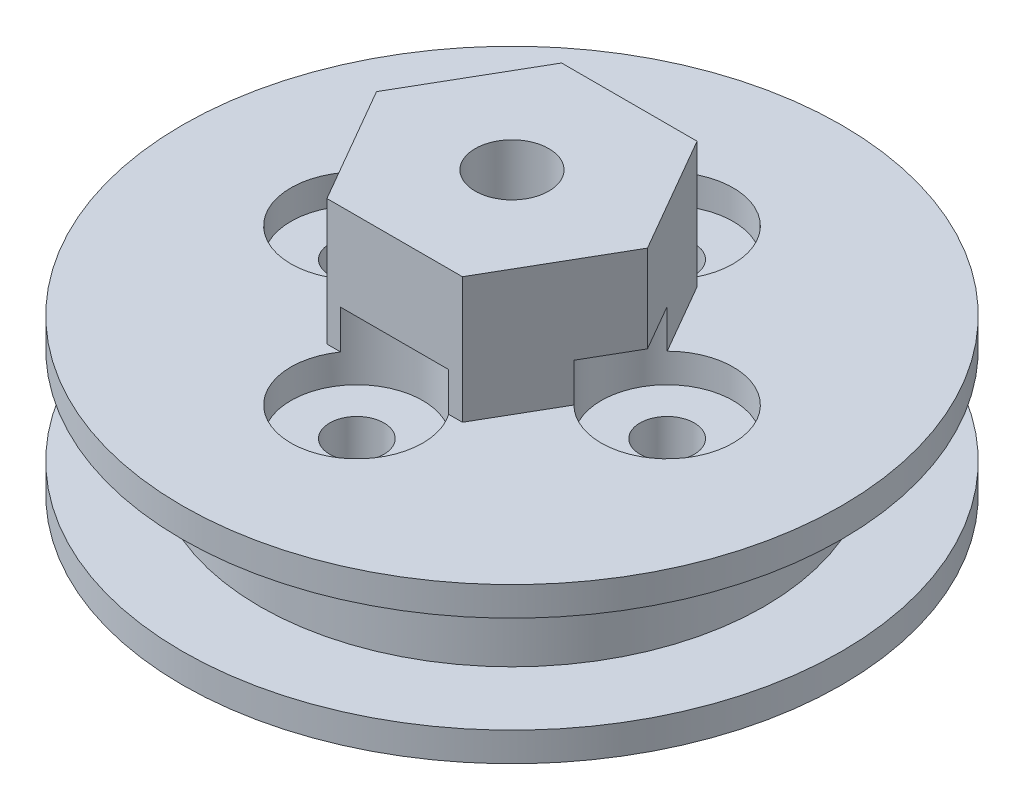
ISO-10303-21;
HEADER;
FILE_DESCRIPTION(('STEP AP214'),'2;1');
FILE_NAME('part.step','',(''),(''),'','','');
FILE_SCHEMA(('AUTOMOTIVE_DESIGN { 1 0 10303 214 1 1 1 1 }'));
ENDSEC;
DATA;
#1=APPLICATION_CONTEXT('core data for automotive mechanical design processes');
#2=APPLICATION_PROTOCOL_DEFINITION('international standard','automotive_design',2000,#1);
#3=PRODUCT_CONTEXT('',#1,'mechanical');
#4=PRODUCT('Part','Part','',(#3));
#5=PRODUCT_RELATED_PRODUCT_CATEGORY('part','',(#4));
#6=PRODUCT_DEFINITION_FORMATION('','',#4);
#7=PRODUCT_DEFINITION_CONTEXT('part definition',#1,'design');
#8=PRODUCT_DEFINITION('design','',#6,#7);
#9=PRODUCT_DEFINITION_SHAPE('','',#8);
#10=(LENGTH_UNIT() NAMED_UNIT(*) SI_UNIT(.MILLI.,.METRE.));
#11=(NAMED_UNIT(*) PLANE_ANGLE_UNIT() SI_UNIT($,.RADIAN.));
#12=(NAMED_UNIT(*) SI_UNIT($,.STERADIAN.) SOLID_ANGLE_UNIT());
#13=UNCERTAINTY_MEASURE_WITH_UNIT(LENGTH_MEASURE(1.E-05),#10,'distance_accuracy_value','');
#14=(GEOMETRIC_REPRESENTATION_CONTEXT(3) GLOBAL_UNCERTAINTY_ASSIGNED_CONTEXT((#13)) GLOBAL_UNIT_ASSIGNED_CONTEXT((#10,
#11,#12)) REPRESENTATION_CONTEXT('',''));
#15=CARTESIAN_POINT('',(0.,0.,0.));
#16=DIRECTION('',(0.,0.,1.));
#17=DIRECTION('',(1.,0.,0.));
#18=AXIS2_PLACEMENT_3D('',#15,#16,#17);
#19=CARTESIAN_POINT('',(0.,8.,0.));
#20=DIRECTION('',(0.,-1.,0.));
#21=DIRECTION('',(0.,0.,-1.));
#22=AXIS2_PLACEMENT_3D('',#19,#20,#21);
#23=CYLINDRICAL_SURFACE('',#22,17.);
#24=CARTESIAN_POINT('',(0.,1.5,0.));
#25=DIRECTION('',(0.,1.,0.));
#26=DIRECTION('',(0.,0.,1.));
#27=AXIS2_PLACEMENT_3D('',#24,#25,#26);
#28=CIRCLE('',#27,17.);
#29=CARTESIAN_POINT('',(0.,1.5,17.));
#30=VERTEX_POINT('',#29);
#31=EDGE_CURVE('E216',#30,#30,#28,.T.);
#32=ORIENTED_EDGE('',*,*,#31,.F.);
#33=EDGE_LOOP('',(#32));
#34=FACE_BOUND('',#33,.T.);
#35=CARTESIAN_POINT('',(0.,0.,0.));
#36=DIRECTION('',(0.,1.,0.));
#37=DIRECTION('',(0.,0.,1.));
#38=AXIS2_PLACEMENT_3D('',#35,#36,#37);
#39=CIRCLE('',#38,17.);
#40=CARTESIAN_POINT('',(0.,0.,17.));
#41=VERTEX_POINT('',#40);
#42=EDGE_CURVE('E49',#41,#41,#39,.T.);
#43=ORIENTED_EDGE('',*,*,#42,.T.);
#44=EDGE_LOOP('',(#43));
#45=FACE_BOUND('',#44,.T.);
#46=ADVANCED_FACE('F45',(#34,#45),#23,.T.);
#47=CARTESIAN_POINT('',(0.,8.,-8.));
#48=DIRECTION('',(0.,-1.,0.));
#49=DIRECTION('',(0.,0.,-1.));
#50=AXIS2_PLACEMENT_3D('',#47,#48,#49);
#51=CYLINDRICAL_SURFACE('',#50,1.4);
#52=CARTESIAN_POINT('',(0.,0.,-8.));
#53=DIRECTION('',(0.,1.,0.));
#54=DIRECTION('',(0.,0.,1.));
#55=AXIS2_PLACEMENT_3D('',#52,#53,#54);
#56=CIRCLE('',#55,1.4);
#57=CARTESIAN_POINT('',(0.,0.,-6.6));
#58=VERTEX_POINT('',#57);
#59=EDGE_CURVE('E345',#58,#58,#56,.T.);
#60=ORIENTED_EDGE('',*,*,#59,.F.);
#61=EDGE_LOOP('',(#60));
#62=FACE_BOUND('',#61,.T.);
#63=CARTESIAN_POINT('',(0.,6.5,-8.));
#64=DIRECTION('',(0.,1.,0.));
#65=DIRECTION('',(0.,0.,1.));
#66=AXIS2_PLACEMENT_3D('',#63,#64,#65);
#67=CIRCLE('',#66,1.4);
#68=CARTESIAN_POINT('',(0.,6.5,-6.6));
#69=VERTEX_POINT('',#68);
#70=EDGE_CURVE('E324',#69,#69,#67,.F.);
#71=ORIENTED_EDGE('',*,*,#70,.F.);
#72=EDGE_LOOP('',(#71));
#73=FACE_BOUND('',#72,.T.);
#74=ADVANCED_FACE('F407',(#62,#73),#51,.F.);
#75=CARTESIAN_POINT('',(8.,8.,0.));
#76=DIRECTION('',(0.,-1.,0.));
#77=DIRECTION('',(0.,0.,-1.));
#78=AXIS2_PLACEMENT_3D('',#75,#76,#77);
#79=CYLINDRICAL_SURFACE('',#78,1.4);
#80=CARTESIAN_POINT('',(8.,0.,0.));
#81=DIRECTION('',(0.,1.,0.));
#82=DIRECTION('',(0.,0.,1.));
#83=AXIS2_PLACEMENT_3D('',#80,#81,#82);
#84=CIRCLE('',#83,1.4);
#85=CARTESIAN_POINT('',(8.,0.,1.40000000000003));
#86=VERTEX_POINT('',#85);
#87=EDGE_CURVE('E341',#86,#86,#84,.T.);
#88=ORIENTED_EDGE('',*,*,#87,.F.);
#89=EDGE_LOOP('',(#88));
#90=FACE_BOUND('',#89,.T.);
#91=CARTESIAN_POINT('',(8.,6.5,0.));
#92=DIRECTION('',(0.,1.,0.));
#93=DIRECTION('',(0.,0.,1.));
#94=AXIS2_PLACEMENT_3D('',#91,#92,#93);
#95=CIRCLE('',#94,1.4);
#96=CARTESIAN_POINT('',(8.,6.5,1.40000000000003));
#97=VERTEX_POINT('',#96);
#98=EDGE_CURVE('E300',#97,#97,#95,.F.);
#99=ORIENTED_EDGE('',*,*,#98,.F.);
#100=EDGE_LOOP('',(#99));
#101=FACE_BOUND('',#100,.T.);
#102=ADVANCED_FACE('F412',(#90,#101),#79,.F.);
#103=CARTESIAN_POINT('',(4.51808198568511E-13,8.,8.));
#104=DIRECTION('',(0.,-1.,0.));
#105=DIRECTION('',(0.,0.,-1.));
#106=AXIS2_PLACEMENT_3D('',#103,#104,#105);
#107=CYLINDRICAL_SURFACE('',#106,1.4);
#108=CARTESIAN_POINT('',(4.51808198568511E-13,0.,8.));
#109=DIRECTION('',(0.,1.,0.));
#110=DIRECTION('',(0.,0.,1.));
#111=AXIS2_PLACEMENT_3D('',#108,#109,#110);
#112=CIRCLE('',#111,1.4);
#113=CARTESIAN_POINT('',(4.51808198568511E-13,0.,9.4));
#114=VERTEX_POINT('',#113);
#115=EDGE_CURVE('E337',#114,#114,#112,.T.);
#116=ORIENTED_EDGE('',*,*,#115,.F.);
#117=EDGE_LOOP('',(#116));
#118=FACE_BOUND('',#117,.T.);
#119=CARTESIAN_POINT('',(4.51808198568511E-13,6.5,8.));
#120=DIRECTION('',(0.,1.,0.));
#121=DIRECTION('',(0.,0.,1.));
#122=AXIS2_PLACEMENT_3D('',#119,#120,#121);
#123=CIRCLE('',#122,1.4);
#124=CARTESIAN_POINT('',(4.51808198568511E-13,6.5,9.4));
#125=VERTEX_POINT('',#124);
#126=EDGE_CURVE('E290',#125,#125,#123,.F.);
#127=ORIENTED_EDGE('',*,*,#126,.F.);
#128=EDGE_LOOP('',(#127));
#129=FACE_BOUND('',#128,.T.);
#130=ADVANCED_FACE('F384',(#118,#129),#107,.F.);
#131=CARTESIAN_POINT('',(-7.99999999999977,8.,2.26883816723573E-13));
#132=DIRECTION('',(0.,-1.,0.));
#133=DIRECTION('',(0.,0.,-1.));
#134=AXIS2_PLACEMENT_3D('',#131,#132,#133);
#135=CYLINDRICAL_SURFACE('',#134,1.4);
#136=CARTESIAN_POINT('',(-7.99999999999977,0.,2.26883816723573E-13));
#137=DIRECTION('',(0.,1.,0.));
#138=DIRECTION('',(0.,0.,1.));
#139=AXIS2_PLACEMENT_3D('',#136,#137,#138);
#140=CIRCLE('',#139,1.4);
#141=CARTESIAN_POINT('',(-7.99999999999977,0.,1.40000000000023));
#142=VERTEX_POINT('',#141);
#143=EDGE_CURVE('E299',#142,#142,#140,.T.);
#144=ORIENTED_EDGE('',*,*,#143,.F.);
#145=EDGE_LOOP('',(#144));
#146=FACE_BOUND('',#145,.T.);
#147=CARTESIAN_POINT('',(-7.99999999999977,6.5,2.26883816723573E-13));
#148=DIRECTION('',(0.,1.,0.));
#149=DIRECTION('',(0.,0.,1.));
#150=AXIS2_PLACEMENT_3D('',#147,#148,#149);
#151=CIRCLE('',#150,1.4);
#152=CARTESIAN_POINT('',(-7.99999999999977,6.5,1.40000000000023));
#153=VERTEX_POINT('',#152);
#154=EDGE_CURVE('E312',#153,#153,#151,.F.);
#155=ORIENTED_EDGE('',*,*,#154,.F.);
#156=EDGE_LOOP('',(#155));
#157=FACE_BOUND('',#156,.T.);
#158=ADVANCED_FACE('F381',(#146,#157),#135,.F.);
#159=CARTESIAN_POINT('',(0.,8.,0.));
#160=DIRECTION('',(0.,1.,0.));
#161=DIRECTION('',(0.,0.,1.));
#162=AXIS2_PLACEMENT_3D('',#159,#160,#161);
#163=PLANE('',#162);
#164=DIRECTION('',(1.,0.,0.));
#165=VECTOR('',#164,1.);
#166=CARTESIAN_POINT('',(-3.49296912859723,8.,6.05));
#167=LINE('',#166,#165);
#168=CARTESIAN_POINT('',(-3.49296912859723,8.,6.05));
#169=VERTEX_POINT('',#168);
#170=CARTESIAN_POINT('',(-2.78522889544064,8.,6.05));
#171=VERTEX_POINT('',#170);
#172=EDGE_CURVE('E223',#169,#171,#167,.T.);
#173=ORIENTED_EDGE('',*,*,#172,.F.);
#174=DIRECTION('',(0.5,0.,0.866025403784438));
#175=VECTOR('',#174,1.);
#176=CARTESIAN_POINT('',(-6.98593825719447,8.,0.));
#177=LINE('',#176,#175);
#178=CARTESIAN_POINT('',(-5.59714136828036,8.,2.40546677299284));
#179=VERTEX_POINT('',#178);
#180=EDGE_CURVE('E12',#179,#169,#177,.T.);
#181=ORIENTED_EDGE('',*,*,#180,.F.);
#182=CARTESIAN_POINT('',(-7.99999999999977,8.,2.26883816723573E-13));
#183=DIRECTION('',(0.,1.,0.));
#184=DIRECTION('',(0.,0.,1.));
#185=AXIS2_PLACEMENT_3D('',#182,#183,#184);
#186=CIRCLE('',#185,3.4);
#187=CARTESIAN_POINT('',(-5.59714136828052,8.,-2.40546677299255));
#188=VERTEX_POINT('',#187);
#189=EDGE_CURVE('E305',#188,#179,#186,.T.);
#190=ORIENTED_EDGE('',*,*,#189,.F.);
#191=DIRECTION('',(-0.5,0.,0.866025403784438));
#192=VECTOR('',#191,1.);
#193=CARTESIAN_POINT('',(-3.49296912859724,8.,-6.05));
#194=LINE('',#193,#192);
#195=CARTESIAN_POINT('',(-3.49296912859724,8.,-6.05));
#196=VERTEX_POINT('',#195);
#197=EDGE_CURVE('E230',#196,#188,#194,.T.);
#198=ORIENTED_EDGE('',*,*,#197,.F.);
#199=DIRECTION('',(-1.,0.,0.));
#200=VECTOR('',#199,1.);
#201=CARTESIAN_POINT('',(3.49296912859723,8.,-6.05));
#202=LINE('',#201,#200);
#203=CARTESIAN_POINT('',(-2.78522889544109,8.,-6.05));
#204=VERTEX_POINT('',#203);
#205=EDGE_CURVE('E55',#204,#196,#202,.T.);
#206=ORIENTED_EDGE('',*,*,#205,.F.);
#207=CARTESIAN_POINT('',(0.,8.,-8.));
#208=DIRECTION('',(0.,1.,0.));
#209=DIRECTION('',(0.,0.,1.));
#210=AXIS2_PLACEMENT_3D('',#207,#208,#209);
#211=CIRCLE('',#210,3.4);
#212=CARTESIAN_POINT('',(2.78522889544109,8.,-6.05));
#213=VERTEX_POINT('',#212);
#214=EDGE_CURVE('E317',#213,#204,#211,.T.);
#215=ORIENTED_EDGE('',*,*,#214,.F.);
#216=CARTESIAN_POINT('',(3.49296912859723,8.,-6.05));
#217=VERTEX_POINT('',#216);
#218=EDGE_CURVE('E168',#217,#213,#202,.T.);
#219=ORIENTED_EDGE('',*,*,#218,.F.);
#220=DIRECTION('',(-0.5,0.,-0.866025403784438));
#221=VECTOR('',#220,1.);
#222=CARTESIAN_POINT('',(6.98593825719447,8.,0.));
#223=LINE('',#222,#221);
#224=CARTESIAN_POINT('',(5.59714136828053,8.,-2.40546677299253));
#225=VERTEX_POINT('',#224);
#226=EDGE_CURVE('E254',#225,#217,#223,.T.);
#227=ORIENTED_EDGE('',*,*,#226,.F.);
#228=CARTESIAN_POINT('',(8.,8.,0.));
#229=DIRECTION('',(0.,1.,0.));
#230=DIRECTION('',(0.,0.,1.));
#231=AXIS2_PLACEMENT_3D('',#228,#229,#230);
#232=CIRCLE('',#231,3.4);
#233=CARTESIAN_POINT('',(5.59714136828051,8.,2.40546677299257));
#234=VERTEX_POINT('',#233);
#235=EDGE_CURVE('E295',#234,#225,#232,.T.);
#236=ORIENTED_EDGE('',*,*,#235,.F.);
#237=DIRECTION('',(0.5,0.,-0.866025403784438));
#238=VECTOR('',#237,1.);
#239=CARTESIAN_POINT('',(3.49296912859723,8.,6.05));
#240=LINE('',#239,#238);
#241=CARTESIAN_POINT('',(3.49296912859723,8.,6.05));
#242=VERTEX_POINT('',#241);
#243=EDGE_CURVE('E249',#242,#234,#240,.T.);
#244=ORIENTED_EDGE('',*,*,#243,.F.);
#245=CARTESIAN_POINT('',(2.78522889544154,8.,6.05));
#246=VERTEX_POINT('',#245);
#247=EDGE_CURVE('E250',#246,#242,#167,.T.);
#248=ORIENTED_EDGE('',*,*,#247,.F.);
#249=CARTESIAN_POINT('',(4.51808198568511E-13,8.,8.));
#250=DIRECTION('',(0.,1.,0.));
#251=DIRECTION('',(0.,0.,1.));
#252=AXIS2_PLACEMENT_3D('',#249,#250,#251);
#253=CIRCLE('',#252,3.4);
#254=EDGE_CURVE('E291',#171,#246,#253,.T.);
#255=ORIENTED_EDGE('',*,*,#254,.F.);
#256=EDGE_LOOP('',(#173,#181,#190,#198,#206,#215,#219,#227,#236,#244,#248,#255));
#257=FACE_BOUND('',#256,.T.);
#258=CARTESIAN_POINT('',(0.,8.,0.));
#259=DIRECTION('',(0.,1.,0.));
#260=DIRECTION('',(0.,0.,1.));
#261=AXIS2_PLACEMENT_3D('',#258,#259,#260);
#262=CIRCLE('',#261,17.);
#263=CARTESIAN_POINT('',(0.,8.,17.));
#264=VERTEX_POINT('',#263);
#265=EDGE_CURVE('E355',#264,#264,#262,.T.);
#266=ORIENTED_EDGE('',*,*,#265,.T.);
#267=EDGE_LOOP('',(#266));
#268=FACE_BOUND('',#267,.T.);
#269=ADVANCED_FACE('F370',(#257,#268),#163,.T.);
#270=CARTESIAN_POINT('',(0.,0.,0.));
#271=DIRECTION('',(0.,1.,0.));
#272=DIRECTION('',(0.,0.,1.));
#273=AXIS2_PLACEMENT_3D('',#270,#271,#272);
#274=PLANE('',#273);
#275=ORIENTED_EDGE('',*,*,#42,.F.);
#276=EDGE_LOOP('',(#275));
#277=FACE_BOUND('',#276,.T.);
#278=CARTESIAN_POINT('',(0.,0.,0.));
#279=DIRECTION('',(0.,1.,0.));
#280=DIRECTION('',(0.,0.,1.));
#281=AXIS2_PLACEMENT_3D('',#278,#279,#280);
#282=CIRCLE('',#281,4.3);
#283=CARTESIAN_POINT('',(0.,0.,4.3));
#284=VERTEX_POINT('',#283);
#285=EDGE_CURVE('E349',#284,#284,#282,.T.);
#286=ORIENTED_EDGE('',*,*,#285,.T.);
#287=EDGE_LOOP('',(#286));
#288=FACE_BOUND('',#287,.T.);
#289=ORIENTED_EDGE('',*,*,#59,.T.);
#290=EDGE_LOOP('',(#289));
#291=FACE_BOUND('',#290,.T.);
#292=ORIENTED_EDGE('',*,*,#87,.T.);
#293=EDGE_LOOP('',(#292));
#294=FACE_BOUND('',#293,.T.);
#295=ORIENTED_EDGE('',*,*,#115,.T.);
#296=EDGE_LOOP('',(#295));
#297=FACE_BOUND('',#296,.T.);
#298=ORIENTED_EDGE('',*,*,#143,.T.);
#299=EDGE_LOOP('',(#298));
#300=FACE_BOUND('',#299,.T.);
#301=ADVANCED_FACE('F367',(#277,#288,#291,#294,#297,#300),#274,.F.);
#302=CARTESIAN_POINT('',(0.,6.5,0.));
#303=DIRECTION('',(0.,1.,0.));
#304=DIRECTION('',(0.,0.,1.));
#305=AXIS2_PLACEMENT_3D('',#302,#303,#304);
#306=CIRCLE('',#305,17.);
#307=CARTESIAN_POINT('',(0.,6.5,17.));
#308=VERTEX_POINT('',#307);
#309=EDGE_CURVE('E426',#308,#308,#306,.T.);
#310=ORIENTED_EDGE('',*,*,#309,.T.);
#311=EDGE_LOOP('',(#310));
#312=FACE_BOUND('',#311,.T.);
#313=ORIENTED_EDGE('',*,*,#265,.F.);
#314=EDGE_LOOP('',(#313));
#315=FACE_BOUND('',#314,.T.);
#316=ADVANCED_FACE('F47',(#312,#315),#23,.T.);
#317=CARTESIAN_POINT('',(0.,8.,0.));
#318=DIRECTION('',(0.,-1.,0.));
#319=DIRECTION('',(0.,0.,-1.));
#320=AXIS2_PLACEMENT_3D('',#317,#318,#319);
#321=CYLINDRICAL_SURFACE('',#320,4.3);
#322=CARTESIAN_POINT('',(0.,8.,0.));
#323=DIRECTION('',(0.,1.,0.));
#324=DIRECTION('',(0.,0.,1.));
#325=AXIS2_PLACEMENT_3D('',#322,#323,#324);
#326=CIRCLE('',#325,4.3);
#327=CARTESIAN_POINT('',(0.,8.,4.3));
#328=VERTEX_POINT('',#327);
#329=EDGE_CURVE('E285',#328,#328,#326,.T.);
#330=ORIENTED_EDGE('',*,*,#329,.T.);
#331=EDGE_LOOP('',(#330));
#332=FACE_BOUND('',#331,.T.);
#333=ORIENTED_EDGE('',*,*,#285,.F.);
#334=EDGE_LOOP('',(#333));
#335=FACE_BOUND('',#334,.T.);
#336=ADVANCED_FACE('F401',(#332,#335),#321,.F.);
#337=CARTESIAN_POINT('',(-7.99999999999977,-9.61665222413705,2.26883816723573E-13));
#338=DIRECTION('',(0.,1.,0.));
#339=DIRECTION('',(0.,0.,1.));
#340=AXIS2_PLACEMENT_3D('',#337,#338,#339);
#341=CYLINDRICAL_SURFACE('',#340,3.4);
#342=CARTESIAN_POINT('',(-7.99999999999977,6.5,2.26883816723573E-13));
#343=DIRECTION('',(0.,1.,0.));
#344=DIRECTION('',(0.,0.,1.));
#345=AXIS2_PLACEMENT_3D('',#342,#343,#344);
#346=CIRCLE('',#345,3.4);
#347=CARTESIAN_POINT('',(-7.99999999999977,6.5,3.40000000000023));
#348=VERTEX_POINT('',#347);
#349=EDGE_CURVE('E316',#348,#348,#346,.F.);
#350=ORIENTED_EDGE('',*,*,#349,.T.);
#351=EDGE_LOOP('',(#350));
#352=FACE_BOUND('',#351,.T.);
#353=ORIENTED_EDGE('',*,*,#189,.T.);
#354=DIRECTION('',(0.,-1.,0.));
#355=VECTOR('',#354,1.);
#356=CARTESIAN_POINT('',(-5.59714136828036,10.,2.40546677299284));
#357=LINE('',#356,#355);
#358=CARTESIAN_POINT('',(-5.59714136828036,10.,2.40546677299284));
#359=VERTEX_POINT('',#358);
#360=EDGE_CURVE('E194',#359,#179,#357,.T.);
#361=ORIENTED_EDGE('',*,*,#360,.F.);
#362=CARTESIAN_POINT('',(-7.99999999999977,10.,2.26883816723573E-13));
#363=DIRECTION('',(0.,-1.,0.));
#364=DIRECTION('',(0.,0.,-1.));
#365=AXIS2_PLACEMENT_3D('',#362,#363,#364);
#366=CIRCLE('',#365,3.4);
#367=CARTESIAN_POINT('',(-5.59714136828052,10.,-2.40546677299255));
#368=VERTEX_POINT('',#367);
#369=EDGE_CURVE('E186',#368,#359,#366,.T.);
#370=ORIENTED_EDGE('',*,*,#369,.F.);
#371=DIRECTION('',(0.,-1.,0.));
#372=VECTOR('',#371,1.);
#373=CARTESIAN_POINT('',(-5.59714136828052,10.,-2.40546677299255));
#374=LINE('',#373,#372);
#375=EDGE_CURVE('E198',#368,#188,#374,.T.);
#376=ORIENTED_EDGE('',*,*,#375,.T.);
#377=EDGE_LOOP('',(#353,#361,#370,#376));
#378=FACE_BOUND('',#377,.T.);
#379=ADVANCED_FACE('F391',(#352,#378),#341,.F.);
#380=CARTESIAN_POINT('',(0.,6.5,0.));
#381=DIRECTION('',(0.,1.,0.));
#382=DIRECTION('',(0.,0.,1.));
#383=AXIS2_PLACEMENT_3D('',#380,#381,#382);
#384=PLANE('',#383);
#385=ORIENTED_EDGE('',*,*,#349,.F.);
#386=EDGE_LOOP('',(#385));
#387=FACE_BOUND('',#386,.T.);
#388=ORIENTED_EDGE('',*,*,#154,.T.);
#389=EDGE_LOOP('',(#388));
#390=FACE_BOUND('',#389,.T.);
#391=ADVANCED_FACE('F388',(#387,#390),#384,.T.);
#392=CARTESIAN_POINT('',(4.51808198568511E-13,-9.61665222413705,8.));
#393=DIRECTION('',(0.,1.,0.));
#394=DIRECTION('',(0.,0.,1.));
#395=AXIS2_PLACEMENT_3D('',#392,#393,#394);
#396=CYLINDRICAL_SURFACE('',#395,3.4);
#397=CARTESIAN_POINT('',(4.51808198568511E-13,6.5,8.));
#398=DIRECTION('',(0.,1.,0.));
#399=DIRECTION('',(0.,0.,1.));
#400=AXIS2_PLACEMENT_3D('',#397,#398,#399);
#401=CIRCLE('',#400,3.4);
#402=CARTESIAN_POINT('',(4.51808198568511E-13,6.5,11.4));
#403=VERTEX_POINT('',#402);
#404=EDGE_CURVE('E286',#403,#403,#401,.F.);
#405=ORIENTED_EDGE('',*,*,#404,.T.);
#406=EDGE_LOOP('',(#405));
#407=FACE_BOUND('',#406,.T.);
#408=ORIENTED_EDGE('',*,*,#254,.T.);
#409=DIRECTION('',(0.,-1.,0.));
#410=VECTOR('',#409,1.);
#411=CARTESIAN_POINT('',(2.78522889544154,10.,6.05));
#412=LINE('',#411,#410);
#413=CARTESIAN_POINT('',(2.78522889544154,10.,6.05));
#414=VERTEX_POINT('',#413);
#415=EDGE_CURVE('E209',#414,#246,#412,.T.);
#416=ORIENTED_EDGE('',*,*,#415,.F.);
#417=CARTESIAN_POINT('',(4.51808198568511E-13,10.,8.));
#418=DIRECTION('',(0.,-1.,0.));
#419=DIRECTION('',(0.,0.,-1.));
#420=AXIS2_PLACEMENT_3D('',#417,#418,#419);
#421=CIRCLE('',#420,3.4);
#422=CARTESIAN_POINT('',(-2.78522889544064,10.,6.05));
#423=VERTEX_POINT('',#422);
#424=EDGE_CURVE('E62',#423,#414,#421,.T.);
#425=ORIENTED_EDGE('',*,*,#424,.F.);
#426=DIRECTION('',(0.,-1.,0.));
#427=VECTOR('',#426,1.);
#428=CARTESIAN_POINT('',(-2.78522889544064,10.,6.05));
#429=LINE('',#428,#427);
#430=EDGE_CURVE('E213',#423,#171,#429,.T.);
#431=ORIENTED_EDGE('',*,*,#430,.T.);
#432=EDGE_LOOP('',(#408,#416,#425,#431));
#433=FACE_BOUND('',#432,.T.);
#434=ADVANCED_FACE('F390',(#407,#433),#396,.F.);
#435=CARTESIAN_POINT('',(0.,6.5,0.));
#436=DIRECTION('',(0.,1.,0.));
#437=DIRECTION('',(0.,0.,1.));
#438=AXIS2_PLACEMENT_3D('',#435,#436,#437);
#439=PLANE('',#438);
#440=ORIENTED_EDGE('',*,*,#404,.F.);
#441=EDGE_LOOP('',(#440));
#442=FACE_BOUND('',#441,.T.);
#443=ORIENTED_EDGE('',*,*,#126,.T.);
#444=EDGE_LOOP('',(#443));
#445=FACE_BOUND('',#444,.T.);
#446=ADVANCED_FACE('F398',(#442,#445),#439,.T.);
#447=CARTESIAN_POINT('',(8.,-9.61665222413705,0.));
#448=DIRECTION('',(0.,1.,0.));
#449=DIRECTION('',(0.,0.,1.));
#450=AXIS2_PLACEMENT_3D('',#447,#448,#449);
#451=CYLINDRICAL_SURFACE('',#450,3.4);
#452=CARTESIAN_POINT('',(8.,6.5,0.));
#453=DIRECTION('',(0.,1.,0.));
#454=DIRECTION('',(0.,0.,1.));
#455=AXIS2_PLACEMENT_3D('',#452,#453,#454);
#456=CIRCLE('',#455,3.4);
#457=CARTESIAN_POINT('',(8.,6.5,3.40000000000003));
#458=VERTEX_POINT('',#457);
#459=EDGE_CURVE('E304',#458,#458,#456,.F.);
#460=ORIENTED_EDGE('',*,*,#459,.T.);
#461=EDGE_LOOP('',(#460));
#462=FACE_BOUND('',#461,.T.);
#463=ORIENTED_EDGE('',*,*,#235,.T.);
#464=DIRECTION('',(0.,-1.,0.));
#465=VECTOR('',#464,1.);
#466=CARTESIAN_POINT('',(5.59714136828053,10.,-2.40546677299253));
#467=LINE('',#466,#465);
#468=CARTESIAN_POINT('',(5.59714136828053,10.,-2.40546677299253));
#469=VERTEX_POINT('',#468);
#470=EDGE_CURVE('E179',#469,#225,#467,.T.);
#471=ORIENTED_EDGE('',*,*,#470,.F.);
#472=CARTESIAN_POINT('',(8.,10.,0.));
#473=DIRECTION('',(0.,-1.,0.));
#474=DIRECTION('',(0.,0.,-1.));
#475=AXIS2_PLACEMENT_3D('',#472,#473,#474);
#476=CIRCLE('',#475,3.4);
#477=CARTESIAN_POINT('',(5.59714136828051,10.,2.40546677299257));
#478=VERTEX_POINT('',#477);
#479=EDGE_CURVE('E70',#478,#469,#476,.T.);
#480=ORIENTED_EDGE('',*,*,#479,.F.);
#481=DIRECTION('',(0.,-1.,0.));
#482=VECTOR('',#481,1.);
#483=CARTESIAN_POINT('',(5.59714136828051,10.,2.40546677299257));
#484=LINE('',#483,#482);
#485=EDGE_CURVE('E183',#478,#234,#484,.T.);
#486=ORIENTED_EDGE('',*,*,#485,.T.);
#487=EDGE_LOOP('',(#463,#471,#480,#486));
#488=FACE_BOUND('',#487,.T.);
#489=ADVANCED_FACE('F504',(#462,#488),#451,.F.);
#490=CARTESIAN_POINT('',(0.,6.5,0.));
#491=DIRECTION('',(0.,1.,0.));
#492=DIRECTION('',(0.,0.,1.));
#493=AXIS2_PLACEMENT_3D('',#490,#491,#492);
#494=PLANE('',#493);
#495=ORIENTED_EDGE('',*,*,#459,.F.);
#496=EDGE_LOOP('',(#495));
#497=FACE_BOUND('',#496,.T.);
#498=ORIENTED_EDGE('',*,*,#98,.T.);
#499=EDGE_LOOP('',(#498));
#500=FACE_BOUND('',#499,.T.);
#501=ADVANCED_FACE('F509',(#497,#500),#494,.T.);
#502=CARTESIAN_POINT('',(0.,-9.61665222413705,-8.));
#503=DIRECTION('',(0.,1.,0.));
#504=DIRECTION('',(0.,0.,1.));
#505=AXIS2_PLACEMENT_3D('',#502,#503,#504);
#506=CYLINDRICAL_SURFACE('',#505,3.4);
#507=CARTESIAN_POINT('',(0.,6.5,-8.));
#508=DIRECTION('',(0.,1.,0.));
#509=DIRECTION('',(0.,0.,1.));
#510=AXIS2_PLACEMENT_3D('',#507,#508,#509);
#511=CIRCLE('',#510,3.4);
#512=CARTESIAN_POINT('',(0.,6.5,-4.6));
#513=VERTEX_POINT('',#512);
#514=EDGE_CURVE('E328',#513,#513,#511,.F.);
#515=ORIENTED_EDGE('',*,*,#514,.T.);
#516=EDGE_LOOP('',(#515));
#517=FACE_BOUND('',#516,.T.);
#518=ORIENTED_EDGE('',*,*,#214,.T.);
#519=DIRECTION('',(0.,-1.,0.));
#520=VECTOR('',#519,1.);
#521=CARTESIAN_POINT('',(-2.78522889544109,10.,-6.05));
#522=LINE('',#521,#520);
#523=CARTESIAN_POINT('',(-2.78522889544109,10.,-6.05));
#524=VERTEX_POINT('',#523);
#525=EDGE_CURVE('E155',#524,#204,#522,.T.);
#526=ORIENTED_EDGE('',*,*,#525,.F.);
#527=CARTESIAN_POINT('',(0.,10.,-8.));
#528=DIRECTION('',(0.,-1.,0.));
#529=DIRECTION('',(0.,0.,-1.));
#530=AXIS2_PLACEMENT_3D('',#527,#528,#529);
#531=CIRCLE('',#530,3.4);
#532=CARTESIAN_POINT('',(2.78522889544109,10.,-6.05));
#533=VERTEX_POINT('',#532);
#534=EDGE_CURVE('E148',#533,#524,#531,.T.);
#535=ORIENTED_EDGE('',*,*,#534,.F.);
#536=DIRECTION('',(0.,-1.,0.));
#537=VECTOR('',#536,1.);
#538=CARTESIAN_POINT('',(2.78522889544109,10.,-6.05));
#539=LINE('',#538,#537);
#540=EDGE_CURVE('E153',#533,#213,#539,.T.);
#541=ORIENTED_EDGE('',*,*,#540,.T.);
#542=EDGE_LOOP('',(#518,#526,#535,#541));
#543=FACE_BOUND('',#542,.T.);
#544=ADVANCED_FACE('F151',(#517,#543),#506,.F.);
#545=CARTESIAN_POINT('',(0.,6.5,0.));
#546=DIRECTION('',(0.,1.,0.));
#547=DIRECTION('',(0.,0.,1.));
#548=AXIS2_PLACEMENT_3D('',#545,#546,#547);
#549=PLANE('',#548);
#550=ORIENTED_EDGE('',*,*,#514,.F.);
#551=EDGE_LOOP('',(#550));
#552=FACE_BOUND('',#551,.T.);
#553=ORIENTED_EDGE('',*,*,#70,.T.);
#554=EDGE_LOOP('',(#553));
#555=FACE_BOUND('',#554,.T.);
#556=ADVANCED_FACE('F477',(#552,#555),#549,.T.);
#557=CARTESIAN_POINT('',(0.,14.5,0.));
#558=DIRECTION('',(0.,1.,0.));
#559=DIRECTION('',(0.,0.,1.));
#560=AXIS2_PLACEMENT_3D('',#557,#558,#559);
#561=PLANE('',#560);
#562=DIRECTION('',(1.,0.,0.));
#563=VECTOR('',#562,1.);
#564=CARTESIAN_POINT('',(-3.49296912859723,14.5,6.05));
#565=LINE('',#564,#563);
#566=CARTESIAN_POINT('',(-3.49296912859723,14.5,6.05));
#567=VERTEX_POINT('',#566);
#568=CARTESIAN_POINT('',(3.49296912859723,14.5,6.05));
#569=VERTEX_POINT('',#568);
#570=EDGE_CURVE('E225',#567,#569,#565,.T.);
#571=ORIENTED_EDGE('',*,*,#570,.T.);
#572=DIRECTION('',(0.5,0.,-0.866025403784438));
#573=VECTOR('',#572,1.);
#574=CARTESIAN_POINT('',(3.49296912859723,14.5,6.05));
#575=LINE('',#574,#573);
#576=CARTESIAN_POINT('',(6.98593825719447,14.5,0.));
#577=VERTEX_POINT('',#576);
#578=EDGE_CURVE('E229',#569,#577,#575,.T.);
#579=ORIENTED_EDGE('',*,*,#578,.T.);
#580=DIRECTION('',(-0.5,0.,-0.866025403784438));
#581=VECTOR('',#580,1.);
#582=CARTESIAN_POINT('',(6.98593825719447,14.5,0.));
#583=LINE('',#582,#581);
#584=CARTESIAN_POINT('',(3.49296912859723,14.5,-6.05));
#585=VERTEX_POINT('',#584);
#586=EDGE_CURVE('E233',#577,#585,#583,.T.);
#587=ORIENTED_EDGE('',*,*,#586,.T.);
#588=DIRECTION('',(-1.,0.,0.));
#589=VECTOR('',#588,1.);
#590=CARTESIAN_POINT('',(3.49296912859723,14.5,-6.05));
#591=LINE('',#590,#589);
#592=CARTESIAN_POINT('',(-3.49296912859724,14.5,-6.05));
#593=VERTEX_POINT('',#592);
#594=EDGE_CURVE('E236',#585,#593,#591,.T.);
#595=ORIENTED_EDGE('',*,*,#594,.T.);
#596=DIRECTION('',(-0.5,0.,0.866025403784438));
#597=VECTOR('',#596,1.);
#598=CARTESIAN_POINT('',(-3.49296912859724,14.5,-6.05));
#599=LINE('',#598,#597);
#600=CARTESIAN_POINT('',(-6.98593825719447,14.5,0.));
#601=VERTEX_POINT('',#600);
#602=EDGE_CURVE('E239',#593,#601,#599,.T.);
#603=ORIENTED_EDGE('',*,*,#602,.T.);
#604=DIRECTION('',(0.5,0.,0.866025403784438));
#605=VECTOR('',#604,1.);
#606=CARTESIAN_POINT('',(-6.98593825719447,14.5,0.));
#607=LINE('',#606,#605);
#608=EDGE_CURVE('E242',#601,#567,#607,.T.);
#609=ORIENTED_EDGE('',*,*,#608,.T.);
#610=EDGE_LOOP('',(#571,#579,#587,#595,#603,#609));
#611=FACE_BOUND('',#610,.T.);
#612=CARTESIAN_POINT('',(0.,14.5,0.));
#613=DIRECTION('',(0.,1.,0.));
#614=DIRECTION('',(0.,0.,1.));
#615=AXIS2_PLACEMENT_3D('',#612,#613,#614);
#616=CIRCLE('',#615,1.9);
#617=CARTESIAN_POINT('',(0.,14.5,-1.9));
#618=VERTEX_POINT('',#617);
#619=EDGE_CURVE('E175',#618,#618,#616,.T.);
#620=ORIENTED_EDGE('',*,*,#619,.F.);
#621=EDGE_LOOP('',(#620));
#622=FACE_BOUND('',#621,.T.);
#623=ADVANCED_FACE('F473',(#611,#622),#561,.T.);
#624=CARTESIAN_POINT('',(0.,8.,0.));
#625=DIRECTION('',(0.,1.,0.));
#626=DIRECTION('',(0.,0.,1.));
#627=AXIS2_PLACEMENT_3D('',#624,#625,#626);
#628=PLANE('',#627);
#629=ORIENTED_EDGE('',*,*,#329,.F.);
#630=EDGE_LOOP('',(#629));
#631=FACE_BOUND('',#630,.T.);
#632=CARTESIAN_POINT('',(0.,8.,0.));
#633=DIRECTION('',(0.,1.,0.));
#634=DIRECTION('',(0.,0.,1.));
#635=AXIS2_PLACEMENT_3D('',#632,#633,#634);
#636=CIRCLE('',#635,1.9);
#637=CARTESIAN_POINT('',(0.,8.,-1.9));
#638=VERTEX_POINT('',#637);
#639=EDGE_CURVE('E170',#638,#638,#636,.T.);
#640=ORIENTED_EDGE('',*,*,#639,.T.);
#641=EDGE_LOOP('',(#640));
#642=FACE_BOUND('',#641,.T.);
#643=ADVANCED_FACE('F476',(#631,#642),#628,.F.);
#644=CARTESIAN_POINT('',(-3.49296912859723,14.5,6.05));
#645=DIRECTION('',(0.,0.,-1.));
#646=DIRECTION('',(-1.,0.,0.));
#647=AXIS2_PLACEMENT_3D('',#644,#645,#646);
#648=PLANE('',#647);
#649=DIRECTION('',(-1.,0.,0.));
#650=VECTOR('',#649,1.);
#651=CARTESIAN_POINT('',(2.78522889544154,10.,6.05));
#652=LINE('',#651,#650);
#653=EDGE_CURVE('E212',#414,#423,#652,.T.);
#654=ORIENTED_EDGE('',*,*,#653,.F.);
#655=ORIENTED_EDGE('',*,*,#415,.T.);
#656=ORIENTED_EDGE('',*,*,#247,.T.);
#657=DIRECTION('',(0.,-1.,0.));
#658=VECTOR('',#657,1.);
#659=CARTESIAN_POINT('',(3.49296912859723,14.5,6.05));
#660=LINE('',#659,#658);
#661=EDGE_CURVE('E281',#569,#242,#660,.T.);
#662=ORIENTED_EDGE('',*,*,#661,.F.);
#663=ORIENTED_EDGE('',*,*,#570,.F.);
#664=DIRECTION('',(0.,-1.,0.));
#665=VECTOR('',#664,1.);
#666=CARTESIAN_POINT('',(-3.49296912859723,14.5,6.05));
#667=LINE('',#666,#665);
#668=EDGE_CURVE('E245',#567,#169,#667,.T.);
#669=ORIENTED_EDGE('',*,*,#668,.T.);
#670=ORIENTED_EDGE('',*,*,#172,.T.);
#671=ORIENTED_EDGE('',*,*,#430,.F.);
#672=EDGE_LOOP('',(#654,#655,#656,#662,#663,#669,#670,#671));
#673=FACE_BOUND('',#672,.T.);
#674=ADVANCED_FACE('F481',(#673),#648,.F.);
#675=CARTESIAN_POINT('',(3.49296912859723,14.5,6.05));
#676=DIRECTION('',(-0.866025403784438,0.,-0.5));
#677=DIRECTION('',(-0.5,0.,0.866025403784439));
#678=AXIS2_PLACEMENT_3D('',#675,#676,#677);
#679=PLANE('',#678);
#680=ORIENTED_EDGE('',*,*,#243,.T.);
#681=ORIENTED_EDGE('',*,*,#485,.F.);
#682=DIRECTION('',(-0.5,0.,0.866025403784439));
#683=VECTOR('',#682,1.);
#684=CARTESIAN_POINT('',(6.98593825719447,10.,0.));
#685=LINE('',#684,#683);
#686=CARTESIAN_POINT('',(6.98593825719447,10.,0.));
#687=VERTEX_POINT('',#686);
#688=EDGE_CURVE('E182',#687,#478,#685,.T.);
#689=ORIENTED_EDGE('',*,*,#688,.F.);
#690=DIRECTION('',(0.,-1.,0.));
#691=VECTOR('',#690,1.);
#692=CARTESIAN_POINT('',(6.98593825719447,14.5,0.));
#693=LINE('',#692,#691);
#694=EDGE_CURVE('E277',#577,#687,#693,.T.);
#695=ORIENTED_EDGE('',*,*,#694,.F.);
#696=ORIENTED_EDGE('',*,*,#578,.F.);
#697=ORIENTED_EDGE('',*,*,#661,.T.);
#698=EDGE_LOOP('',(#680,#681,#689,#695,#696,#697));
#699=FACE_BOUND('',#698,.T.);
#700=ADVANCED_FACE('F495',(#699),#679,.F.);
#701=CARTESIAN_POINT('',(6.98593825719447,14.5,0.));
#702=DIRECTION('',(-0.866025403784438,0.,0.5));
#703=DIRECTION('',(0.5,0.,0.866025403784438));
#704=AXIS2_PLACEMENT_3D('',#701,#702,#703);
#705=PLANE('',#704);
#706=DIRECTION('',(0.5,0.,0.866025403784438));
#707=VECTOR('',#706,1.);
#708=CARTESIAN_POINT('',(5.59714136828053,10.,-2.40546677299253));
#709=LINE('',#708,#707);
#710=EDGE_CURVE('E189',#469,#687,#709,.T.);
#711=ORIENTED_EDGE('',*,*,#710,.F.);
#712=ORIENTED_EDGE('',*,*,#470,.T.);
#713=ORIENTED_EDGE('',*,*,#226,.T.);
#714=DIRECTION('',(0.,-1.,0.));
#715=VECTOR('',#714,1.);
#716=CARTESIAN_POINT('',(3.49296912859723,14.5,-6.05));
#717=LINE('',#716,#715);
#718=EDGE_CURVE('E274',#585,#217,#717,.T.);
#719=ORIENTED_EDGE('',*,*,#718,.F.);
#720=ORIENTED_EDGE('',*,*,#586,.F.);
#721=ORIENTED_EDGE('',*,*,#694,.T.);
#722=EDGE_LOOP('',(#711,#712,#713,#719,#720,#721));
#723=FACE_BOUND('',#722,.T.);
#724=ADVANCED_FACE('F492',(#723),#705,.F.);
#725=CARTESIAN_POINT('',(3.49296912859723,14.5,-6.05));
#726=DIRECTION('',(0.,0.,1.));
#727=DIRECTION('',(1.,0.,0.));
#728=AXIS2_PLACEMENT_3D('',#725,#726,#727);
#729=PLANE('',#728);
#730=DIRECTION('',(1.,0.,0.));
#731=VECTOR('',#730,1.);
#732=CARTESIAN_POINT('',(-2.78522889544109,10.,-6.05));
#733=LINE('',#732,#731);
#734=EDGE_CURVE('E159',#524,#533,#733,.T.);
#735=ORIENTED_EDGE('',*,*,#734,.F.);
#736=ORIENTED_EDGE('',*,*,#525,.T.);
#737=ORIENTED_EDGE('',*,*,#205,.T.);
#738=DIRECTION('',(0.,-1.,0.));
#739=VECTOR('',#738,1.);
#740=CARTESIAN_POINT('',(-3.49296912859724,14.5,-6.05));
#741=LINE('',#740,#739);
#742=EDGE_CURVE('E270',#593,#196,#741,.T.);
#743=ORIENTED_EDGE('',*,*,#742,.F.);
#744=ORIENTED_EDGE('',*,*,#594,.F.);
#745=ORIENTED_EDGE('',*,*,#718,.T.);
#746=ORIENTED_EDGE('',*,*,#218,.T.);
#747=ORIENTED_EDGE('',*,*,#540,.F.);
#748=EDGE_LOOP('',(#735,#736,#737,#743,#744,#745,#746,#747));
#749=FACE_BOUND('',#748,.T.);
#750=ADVANCED_FACE('F166',(#749),#729,.F.);
#751=CARTESIAN_POINT('',(-3.49296912859724,14.5,-6.05));
#752=DIRECTION('',(0.866025403784439,0.,0.5));
#753=DIRECTION('',(0.5,0.,-0.866025403784439));
#754=AXIS2_PLACEMENT_3D('',#751,#752,#753);
#755=PLANE('',#754);
#756=ORIENTED_EDGE('',*,*,#197,.T.);
#757=ORIENTED_EDGE('',*,*,#375,.F.);
#758=DIRECTION('',(0.5,0.,-0.866025403784439));
#759=VECTOR('',#758,1.);
#760=CARTESIAN_POINT('',(-6.98593825719447,10.,0.));
#761=LINE('',#760,#759);
#762=CARTESIAN_POINT('',(-6.98593825719447,10.,0.));
#763=VERTEX_POINT('',#762);
#764=EDGE_CURVE('E197',#763,#368,#761,.T.);
#765=ORIENTED_EDGE('',*,*,#764,.F.);
#766=DIRECTION('',(0.,-1.,0.));
#767=VECTOR('',#766,1.);
#768=CARTESIAN_POINT('',(-6.98593825719447,14.5,0.));
#769=LINE('',#768,#767);
#770=EDGE_CURVE('E266',#601,#763,#769,.T.);
#771=ORIENTED_EDGE('',*,*,#770,.F.);
#772=ORIENTED_EDGE('',*,*,#602,.F.);
#773=ORIENTED_EDGE('',*,*,#742,.T.);
#774=EDGE_LOOP('',(#756,#757,#765,#771,#772,#773));
#775=FACE_BOUND('',#774,.T.);
#776=ADVANCED_FACE('F485',(#775),#755,.F.);
#777=CARTESIAN_POINT('',(-6.98593825719447,14.5,0.));
#778=DIRECTION('',(0.866025403784438,0.,-0.5));
#779=DIRECTION('',(-0.5,0.,-0.866025403784439));
#780=AXIS2_PLACEMENT_3D('',#777,#778,#779);
#781=PLANE('',#780);
#782=DIRECTION('',(-0.5,0.,-0.866025403784438));
#783=VECTOR('',#782,1.);
#784=CARTESIAN_POINT('',(-5.59714136828036,10.,2.40546677299284));
#785=LINE('',#784,#783);
#786=EDGE_CURVE('E204',#359,#763,#785,.T.);
#787=ORIENTED_EDGE('',*,*,#786,.F.);
#788=ORIENTED_EDGE('',*,*,#360,.T.);
#789=ORIENTED_EDGE('',*,*,#180,.T.);
#790=ORIENTED_EDGE('',*,*,#668,.F.);
#791=ORIENTED_EDGE('',*,*,#608,.F.);
#792=ORIENTED_EDGE('',*,*,#770,.T.);
#793=EDGE_LOOP('',(#787,#788,#789,#790,#791,#792));
#794=FACE_BOUND('',#793,.T.);
#795=ADVANCED_FACE('F471',(#794),#781,.F.);
#796=CARTESIAN_POINT('',(0.,14.5,0.));
#797=DIRECTION('',(0.,-1.,0.));
#798=DIRECTION('',(0.,0.,-1.));
#799=AXIS2_PLACEMENT_3D('',#796,#797,#798);
#800=CYLINDRICAL_SURFACE('',#799,1.9);
#801=CARTESIAN_POINT('',(0.,14.5,-1.9));
#802=CARTESIAN_POINT('',(0.,14.4322916666667,-1.9));
#803=CARTESIAN_POINT('',(0.,14.3645833333333,-1.9));
#804=CARTESIAN_POINT('',(0.,14.2291666666667,-1.9));
#805=CARTESIAN_POINT('',(0.,14.1614583333333,-1.9));
#806=CARTESIAN_POINT('',(0.,14.0260416666667,-1.9));
#807=CARTESIAN_POINT('',(0.,13.9583333333333,-1.9));
#808=CARTESIAN_POINT('',(0.,13.8229166666667,-1.9));
#809=CARTESIAN_POINT('',(0.,13.7552083333333,-1.9));
#810=CARTESIAN_POINT('',(0.,13.6197916666667,-1.9));
#811=CARTESIAN_POINT('',(0.,13.5520833333333,-1.9));
#812=CARTESIAN_POINT('',(0.,13.4166666666667,-1.9));
#813=CARTESIAN_POINT('',(0.,13.3489583333333,-1.9));
#814=CARTESIAN_POINT('',(0.,13.2135416666667,-1.9));
#815=CARTESIAN_POINT('',(0.,13.1458333333333,-1.9));
#816=CARTESIAN_POINT('',(0.,13.0104166666667,-1.9));
#817=CARTESIAN_POINT('',(0.,12.9427083333333,-1.9));
#818=CARTESIAN_POINT('',(0.,12.8072916666667,-1.9));
#819=CARTESIAN_POINT('',(0.,12.7395833333333,-1.9));
#820=CARTESIAN_POINT('',(0.,12.6041666666667,-1.9));
#821=CARTESIAN_POINT('',(0.,12.5364583333333,-1.9));
#822=CARTESIAN_POINT('',(0.,12.4010416666667,-1.9));
#823=CARTESIAN_POINT('',(0.,12.3333333333333,-1.9));
#824=CARTESIAN_POINT('',(0.,12.1979166666667,-1.9));
#825=CARTESIAN_POINT('',(0.,12.1302083333333,-1.9));
#826=CARTESIAN_POINT('',(0.,11.9947916666667,-1.9));
#827=CARTESIAN_POINT('',(0.,11.9270833333333,-1.9));
#828=CARTESIAN_POINT('',(0.,11.7916666666667,-1.9));
#829=CARTESIAN_POINT('',(0.,11.7239583333333,-1.9));
#830=CARTESIAN_POINT('',(0.,11.5885416666667,-1.9));
#831=CARTESIAN_POINT('',(0.,11.5208333333333,-1.9));
#832=CARTESIAN_POINT('',(0.,11.3854166666667,-1.9));
#833=CARTESIAN_POINT('',(0.,11.3177083333333,-1.9));
#834=CARTESIAN_POINT('',(0.,11.1822916666667,-1.9));
#835=CARTESIAN_POINT('',(0.,11.1145833333333,-1.9));
#836=CARTESIAN_POINT('',(0.,10.9791666666667,-1.9));
#837=CARTESIAN_POINT('',(0.,10.9114583333333,-1.9));
#838=CARTESIAN_POINT('',(0.,10.7760416666667,-1.9));
#839=CARTESIAN_POINT('',(0.,10.7083333333333,-1.9));
#840=CARTESIAN_POINT('',(0.,10.5729166666667,-1.9));
#841=CARTESIAN_POINT('',(0.,10.5052083333333,-1.9));
#842=CARTESIAN_POINT('',(0.,10.3697916666667,-1.9));
#843=CARTESIAN_POINT('',(0.,10.3020833333333,-1.9));
#844=CARTESIAN_POINT('',(0.,10.1666666666667,-1.9));
#845=CARTESIAN_POINT('',(0.,10.0989583333333,-1.9));
#846=CARTESIAN_POINT('',(0.,9.96354166666667,-1.9));
#847=CARTESIAN_POINT('',(0.,9.89583333333333,-1.9));
#848=CARTESIAN_POINT('',(0.,9.76041666666667,-1.9));
#849=CARTESIAN_POINT('',(0.,9.69270833333333,-1.9));
#850=CARTESIAN_POINT('',(0.,9.55729166666667,-1.9));
#851=CARTESIAN_POINT('',(0.,9.48958333333333,-1.9));
#852=CARTESIAN_POINT('',(0.,9.35416666666667,-1.9));
#853=CARTESIAN_POINT('',(0.,9.28645833333333,-1.9));
#854=CARTESIAN_POINT('',(0.,9.15104166666667,-1.9));
#855=CARTESIAN_POINT('',(0.,9.08333333333333,-1.9));
#856=CARTESIAN_POINT('',(0.,8.94791666666667,-1.9));
#857=CARTESIAN_POINT('',(0.,8.88020833333333,-1.9));
#858=CARTESIAN_POINT('',(0.,8.74479166666667,-1.9));
#859=CARTESIAN_POINT('',(0.,8.67708333333333,-1.9));
#860=CARTESIAN_POINT('',(0.,8.54166666666667,-1.9));
#861=CARTESIAN_POINT('',(0.,8.47395833333333,-1.9));
#862=CARTESIAN_POINT('',(0.,8.33854166666667,-1.9));
#863=CARTESIAN_POINT('',(0.,8.27083333333333,-1.9));
#864=CARTESIAN_POINT('',(0.,8.13541666666667,-1.9));
#865=CARTESIAN_POINT('',(0.,8.06770833333333,-1.9));
#866=CARTESIAN_POINT('',(0.,8.,-1.9));
#867=B_SPLINE_CURVE_WITH_KNOTS('',3,(#801,#802,#803,#804,#805,#806,#807,#808,#809,#810,#811,
#812,#813,#814,#815,#816,#817,#818,#819,#820,#821,#822,#823,#824,#825,#826,#827,#828,#829,#830,
#831,#832,#833,#834,#835,#836,#837,#838,#839,#840,#841,#842,#843,#844,#845,#846,#847,#848,#849,
#850,#851,#852,#853,#854,#855,#856,#857,#858,#859,#860,#861,#862,#863,#864,#865,#866),
.UNSPECIFIED.,.F.,.F.,(4,2,2,2,2,2,2,2,2,2,2,2,2,2,2,2,2,2,2,2,2,2,2,2,2,2,2,2,2,2,2,2,4),(0.,
0.203125,0.40625,0.609375000000001,0.812500000000001,1.015625,1.21875,1.421875,1.625,1.828125,
2.03125,2.234375,2.4375,2.640625,2.84375,3.046875,3.25,3.453125,3.65625,3.859375,4.0625,
4.265625,4.46875,4.671875,4.875,5.078125,5.28125,5.484375,5.6875,5.890625,6.09375,6.296875,6.5),.UNSPECIFIED.);
#868=EDGE_CURVE('BSEAM466',#618,#638,#867,.T.);
#869=ORIENTED_EDGE('',*,*,#619,.T.);
#870=ORIENTED_EDGE('',*,*,#639,.F.);
#871=ORIENTED_EDGE('',*,*,#868,.T.);
#872=ORIENTED_EDGE('',*,*,#868,.F.);
#873=EDGE_LOOP('',(#869,#871,#870,#872));
#874=FACE_BOUND('',#873,.T.);
#875=ADVANCED_FACE('F466',(#874),#800,.F.);
#876=CARTESIAN_POINT('',(-7.99999999999977,10.,2.26883816723573E-13));
#877=DIRECTION('',(0.,-1.,0.));
#878=DIRECTION('',(0.,0.,-1.));
#879=AXIS2_PLACEMENT_3D('',#876,#877,#878);
#880=PLANE('',#879);
#881=ORIENTED_EDGE('',*,*,#369,.T.);
#882=ORIENTED_EDGE('',*,*,#786,.T.);
#883=ORIENTED_EDGE('',*,*,#764,.T.);
#884=EDGE_LOOP('',(#881,#882,#883));
#885=FACE_BOUND('',#884,.T.);
#886=ADVANCED_FACE('F462',(#885),#880,.T.);
#887=CARTESIAN_POINT('',(0.,10.,-8.));
#888=DIRECTION('',(0.,-1.,0.));
#889=DIRECTION('',(0.,0.,-1.));
#890=AXIS2_PLACEMENT_3D('',#887,#888,#889);
#891=PLANE('',#890);
#892=ORIENTED_EDGE('',*,*,#534,.T.);
#893=ORIENTED_EDGE('',*,*,#734,.T.);
#894=EDGE_LOOP('',(#892,#893));
#895=FACE_BOUND('',#894,.T.);
#896=ADVANCED_FACE('F161',(#895),#891,.T.);
#897=CARTESIAN_POINT('',(8.,10.,0.));
#898=DIRECTION('',(0.,-1.,0.));
#899=DIRECTION('',(0.,0.,-1.));
#900=AXIS2_PLACEMENT_3D('',#897,#898,#899);
#901=PLANE('',#900);
#902=ORIENTED_EDGE('',*,*,#479,.T.);
#903=ORIENTED_EDGE('',*,*,#710,.T.);
#904=ORIENTED_EDGE('',*,*,#688,.T.);
#905=EDGE_LOOP('',(#902,#903,#904));
#906=FACE_BOUND('',#905,.T.);
#907=ADVANCED_FACE('F455',(#906),#901,.T.);
#908=CARTESIAN_POINT('',(4.51808198568511E-13,10.,8.));
#909=DIRECTION('',(0.,-1.,0.));
#910=DIRECTION('',(0.,0.,-1.));
#911=AXIS2_PLACEMENT_3D('',#908,#909,#910);
#912=PLANE('',#911);
#913=ORIENTED_EDGE('',*,*,#424,.T.);
#914=ORIENTED_EDGE('',*,*,#653,.T.);
#915=EDGE_LOOP('',(#913,#914));
#916=FACE_BOUND('',#915,.T.);
#917=ADVANCED_FACE('F445',(#916),#912,.T.);
#918=CARTESIAN_POINT('',(0.,1.5,17.));
#919=DIRECTION('',(0.,-1.,0.));
#920=DIRECTION('',(0.,0.,-1.));
#921=AXIS2_PLACEMENT_3D('',#918,#919,#920);
#922=PLANE('',#921);
#923=CARTESIAN_POINT('',(0.,1.5,0.));
#924=DIRECTION('',(0.,1.,0.));
#925=DIRECTION('',(0.,0.,1.));
#926=AXIS2_PLACEMENT_3D('',#923,#924,#925);
#927=CIRCLE('',#926,13.);
#928=CARTESIAN_POINT('',(0.,1.5,13.));
#929=VERTEX_POINT('',#928);
#930=EDGE_CURVE('E433',#929,#929,#927,.T.);
#931=ORIENTED_EDGE('',*,*,#930,.F.);
#932=EDGE_LOOP('',(#931));
#933=FACE_BOUND('',#932,.T.);
#934=ORIENTED_EDGE('',*,*,#31,.T.);
#935=EDGE_LOOP('',(#934));
#936=FACE_BOUND('',#935,.T.);
#937=ADVANCED_FACE('F442',(#933,#936),#922,.F.);
#938=CARTESIAN_POINT('',(0.,18.7094897508567,0.));
#939=DIRECTION('',(0.,1.,0.));
#940=DIRECTION('',(0.,0.,1.));
#941=AXIS2_PLACEMENT_3D('',#938,#939,#940);
#942=CYLINDRICAL_SURFACE('',#941,13.);
#943=CARTESIAN_POINT('',(0.,6.5,0.));
#944=DIRECTION('',(0.,1.,0.));
#945=DIRECTION('',(0.,0.,1.));
#946=AXIS2_PLACEMENT_3D('',#943,#944,#945);
#947=CIRCLE('',#946,13.);
#948=CARTESIAN_POINT('',(0.,6.5,13.));
#949=VERTEX_POINT('',#948);
#950=EDGE_CURVE('E429',#949,#949,#947,.T.);
#951=ORIENTED_EDGE('',*,*,#950,.F.);
#952=EDGE_LOOP('',(#951));
#953=FACE_BOUND('',#952,.T.);
#954=ORIENTED_EDGE('',*,*,#930,.T.);
#955=EDGE_LOOP('',(#954));
#956=FACE_BOUND('',#955,.T.);
#957=ADVANCED_FACE('F444',(#953,#956),#942,.T.);
#958=CARTESIAN_POINT('',(0.,6.5,17.));
#959=DIRECTION('',(0.,1.,0.));
#960=DIRECTION('',(0.,0.,1.));
#961=AXIS2_PLACEMENT_3D('',#958,#959,#960);
#962=PLANE('',#961);
#963=ORIENTED_EDGE('',*,*,#309,.F.);
#964=EDGE_LOOP('',(#963));
#965=FACE_BOUND('',#964,.T.);
#966=ORIENTED_EDGE('',*,*,#950,.T.);
#967=EDGE_LOOP('',(#966));
#968=FACE_BOUND('',#967,.T.);
#969=ADVANCED_FACE('F452',(#965,#968),#962,.F.);
#970=CLOSED_SHELL('',(#46,#74,#102,#130,#158,#269,#301,#316,#336,#379,#391,#434,#446,#489,#501,
#544,#556,#623,#643,#674,#700,#724,#750,#776,#795,#875,#886,#896,#907,#917,#937,#957,#969));
#971=MANIFOLD_SOLID_BREP('B2',#970);
#972=ADVANCED_BREP_SHAPE_REPRESENTATION('',(#18,#971),#14);
#973=SHAPE_DEFINITION_REPRESENTATION(#9,#972);
ENDSEC;
END-ISO-10303-21;
